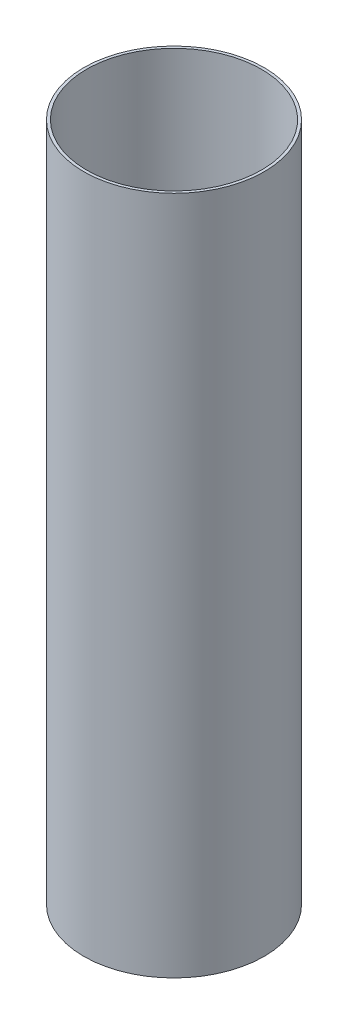
ISO-10303-21;
HEADER;
FILE_DESCRIPTION(('STEP AP214'),'2;1');
FILE_NAME('part.step','',(''),(''),'','','');
FILE_SCHEMA(('AUTOMOTIVE_DESIGN { 1 0 10303 214 1 1 1 1 }'));
ENDSEC;
DATA;
#1=APPLICATION_CONTEXT('core data for automotive mechanical design processes');
#2=APPLICATION_PROTOCOL_DEFINITION('international standard','automotive_design',2000,#1);
#3=PRODUCT_CONTEXT('',#1,'mechanical');
#4=PRODUCT('Part','Part','',(#3));
#5=PRODUCT_RELATED_PRODUCT_CATEGORY('part','',(#4));
#6=PRODUCT_DEFINITION_FORMATION('','',#4);
#7=PRODUCT_DEFINITION_CONTEXT('part definition',#1,'design');
#8=PRODUCT_DEFINITION('design','',#6,#7);
#9=PRODUCT_DEFINITION_SHAPE('','',#8);
#10=(LENGTH_UNIT() NAMED_UNIT(*) SI_UNIT(.MILLI.,.METRE.));
#11=(NAMED_UNIT(*) PLANE_ANGLE_UNIT() SI_UNIT($,.RADIAN.));
#12=(NAMED_UNIT(*) SI_UNIT($,.STERADIAN.) SOLID_ANGLE_UNIT());
#13=UNCERTAINTY_MEASURE_WITH_UNIT(LENGTH_MEASURE(1.E-05),#10,'distance_accuracy_value','');
#14=(GEOMETRIC_REPRESENTATION_CONTEXT(3) GLOBAL_UNCERTAINTY_ASSIGNED_CONTEXT((#13)) GLOBAL_UNIT_ASSIGNED_CONTEXT((#10,
#11,#12)) REPRESENTATION_CONTEXT('',''));
#15=CARTESIAN_POINT('',(0.,0.,0.));
#16=DIRECTION('',(0.,0.,1.));
#17=DIRECTION('',(1.,0.,0.));
#18=AXIS2_PLACEMENT_3D('',#15,#16,#17);
#19=CARTESIAN_POINT('',(0.,385.,0.));
#20=DIRECTION('',(0.,1.,0.));
#21=DIRECTION('',(0.,0.,1.));
#22=AXIS2_PLACEMENT_3D('',#19,#20,#21);
#23=PLANE('',#22);
#24=CARTESIAN_POINT('',(0.,385.,0.));
#25=DIRECTION('',(0.,1.,0.));
#26=DIRECTION('',(0.,0.,1.));
#27=AXIS2_PLACEMENT_3D('',#24,#25,#26);
#28=CIRCLE('',#27,51.1048);
#29=CARTESIAN_POINT('',(0.,385.,51.1048));
#30=VERTEX_POINT('',#29);
#31=EDGE_CURVE('E10',#30,#30,#28,.T.);
#32=ORIENTED_EDGE('',*,*,#31,.T.);
#33=EDGE_LOOP('',(#32));
#34=FACE_BOUND('',#33,.T.);
#35=CARTESIAN_POINT('',(0.,385.,0.));
#36=DIRECTION('',(0.,1.,0.));
#37=DIRECTION('',(0.,0.,1.));
#38=AXIS2_PLACEMENT_3D('',#35,#36,#37);
#39=CIRCLE('',#38,49.53);
#40=CARTESIAN_POINT('',(0.,385.,49.53));
#41=VERTEX_POINT('',#40);
#42=EDGE_CURVE('E48',#41,#41,#39,.T.);
#43=ORIENTED_EDGE('',*,*,#42,.F.);
#44=EDGE_LOOP('',(#43));
#45=FACE_BOUND('',#44,.T.);
#46=ADVANCED_FACE('F37',(#34,#45),#23,.T.);
#47=CARTESIAN_POINT('',(0.,0.,0.));
#48=DIRECTION('',(0.,1.,0.));
#49=DIRECTION('',(0.,0.,1.));
#50=AXIS2_PLACEMENT_3D('',#47,#48,#49);
#51=PLANE('',#50);
#52=CARTESIAN_POINT('',(0.,0.,0.));
#53=DIRECTION('',(0.,1.,0.));
#54=DIRECTION('',(0.,0.,1.));
#55=AXIS2_PLACEMENT_3D('',#52,#53,#54);
#56=CIRCLE('',#55,51.1048);
#57=CARTESIAN_POINT('',(0.,0.,51.1048));
#58=VERTEX_POINT('',#57);
#59=EDGE_CURVE('E41',#58,#58,#56,.T.);
#60=ORIENTED_EDGE('',*,*,#59,.F.);
#61=EDGE_LOOP('',(#60));
#62=FACE_BOUND('',#61,.T.);
#63=CARTESIAN_POINT('',(0.,0.,0.));
#64=DIRECTION('',(0.,1.,0.));
#65=DIRECTION('',(0.,0.,1.));
#66=AXIS2_PLACEMENT_3D('',#63,#64,#65);
#67=CIRCLE('',#66,49.53);
#68=CARTESIAN_POINT('',(0.,0.,49.53));
#69=VERTEX_POINT('',#68);
#70=EDGE_CURVE('E50',#69,#69,#67,.T.);
#71=ORIENTED_EDGE('',*,*,#70,.T.);
#72=EDGE_LOOP('',(#71));
#73=FACE_BOUND('',#72,.T.);
#74=ADVANCED_FACE('F60',(#62,#73),#51,.F.);
#75=CARTESIAN_POINT('',(0.,385.,0.));
#76=DIRECTION('',(0.,-1.,0.));
#77=DIRECTION('',(0.,0.,-1.));
#78=AXIS2_PLACEMENT_3D('',#75,#76,#77);
#79=CYLINDRICAL_SURFACE('',#78,51.1048);
#80=ORIENTED_EDGE('',*,*,#31,.F.);
#81=EDGE_LOOP('',(#80));
#82=FACE_BOUND('',#81,.T.);
#83=ORIENTED_EDGE('',*,*,#59,.T.);
#84=EDGE_LOOP('',(#83));
#85=FACE_BOUND('',#84,.T.);
#86=ADVANCED_FACE('F39',(#82,#85),#79,.T.);
#87=CARTESIAN_POINT('',(0.,385.,0.));
#88=DIRECTION('',(0.,-1.,0.));
#89=DIRECTION('',(0.,0.,-1.));
#90=AXIS2_PLACEMENT_3D('',#87,#88,#89);
#91=CYLINDRICAL_SURFACE('',#90,49.53);
#92=ORIENTED_EDGE('',*,*,#42,.T.);
#93=EDGE_LOOP('',(#92));
#94=FACE_BOUND('',#93,.T.);
#95=ORIENTED_EDGE('',*,*,#70,.F.);
#96=EDGE_LOOP('',(#95));
#97=FACE_BOUND('',#96,.T.);
#98=ADVANCED_FACE('F56',(#94,#97),#91,.F.);
#99=CLOSED_SHELL('',(#46,#74,#86,#98));
#100=MANIFOLD_SOLID_BREP('B2',#99);
#101=ADVANCED_BREP_SHAPE_REPRESENTATION('',(#18,#100),#14);
#102=SHAPE_DEFINITION_REPRESENTATION(#9,#101);
ENDSEC;
END-ISO-10303-21;
